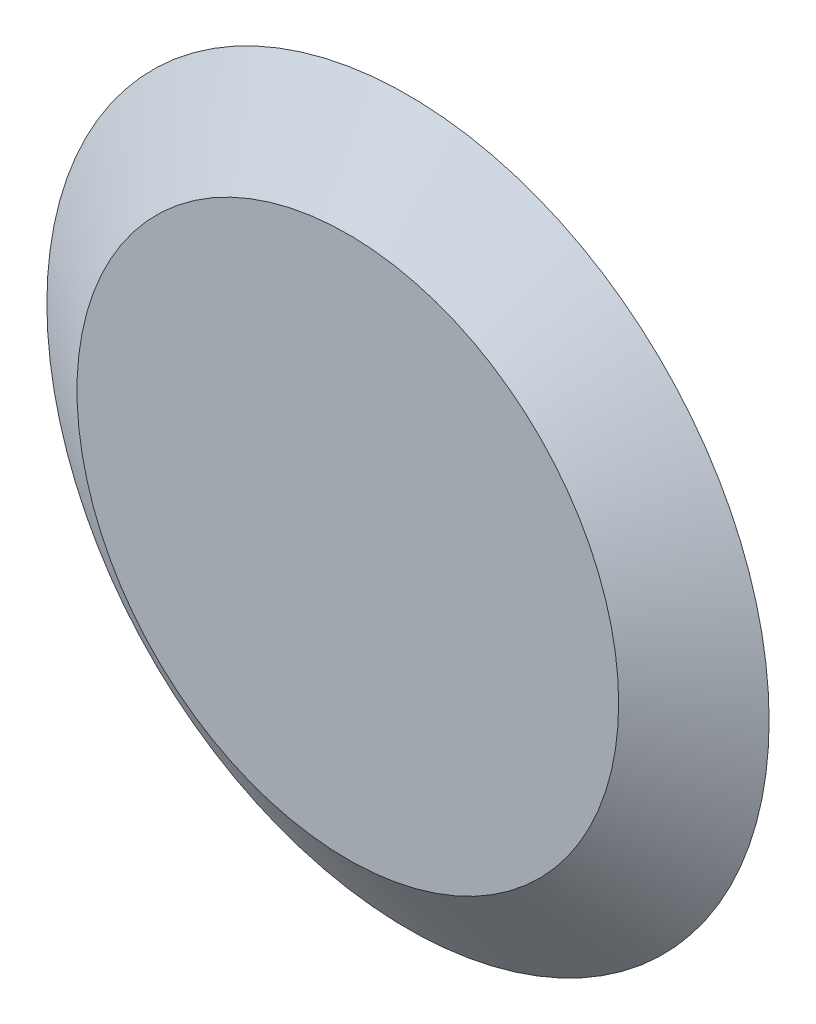
ISO-10303-21;
HEADER;
FILE_DESCRIPTION(('STEP AP214'),'2;1');
FILE_NAME('part.step','',(''),(''),'','','');
FILE_SCHEMA(('AUTOMOTIVE_DESIGN { 1 0 10303 214 1 1 1 1 }'));
ENDSEC;
DATA;
#1=APPLICATION_CONTEXT('core data for automotive mechanical design processes');
#2=APPLICATION_PROTOCOL_DEFINITION('international standard','automotive_design',2000,#1);
#3=PRODUCT_CONTEXT('',#1,'mechanical');
#4=PRODUCT('Part','Part','',(#3));
#5=PRODUCT_RELATED_PRODUCT_CATEGORY('part','',(#4));
#6=PRODUCT_DEFINITION_FORMATION('','',#4);
#7=PRODUCT_DEFINITION_CONTEXT('part definition',#1,'design');
#8=PRODUCT_DEFINITION('design','',#6,#7);
#9=PRODUCT_DEFINITION_SHAPE('','',#8);
#10=(LENGTH_UNIT() NAMED_UNIT(*) SI_UNIT(.MILLI.,.METRE.));
#11=(NAMED_UNIT(*) PLANE_ANGLE_UNIT() SI_UNIT($,.RADIAN.));
#12=(NAMED_UNIT(*) SI_UNIT($,.STERADIAN.) SOLID_ANGLE_UNIT());
#13=UNCERTAINTY_MEASURE_WITH_UNIT(LENGTH_MEASURE(1.E-05),#10,'distance_accuracy_value','');
#14=(GEOMETRIC_REPRESENTATION_CONTEXT(3) GLOBAL_UNCERTAINTY_ASSIGNED_CONTEXT((#13)) GLOBAL_UNIT_ASSIGNED_CONTEXT((#10,
#11,#12)) REPRESENTATION_CONTEXT('',''));
#15=CARTESIAN_POINT('',(0.,0.,0.));
#16=DIRECTION('',(0.,0.,1.));
#17=DIRECTION('',(1.,0.,0.));
#18=AXIS2_PLACEMENT_3D('',#15,#16,#17);
#19=CARTESIAN_POINT('',(0.,0.,0.));
#20=DIRECTION('',(0.,0.,1.));
#21=DIRECTION('',(1.,0.,0.));
#22=AXIS2_PLACEMENT_3D('',#19,#20,#21);
#23=PLANE('',#22);
#24=CARTESIAN_POINT('',(0.,0.,0.));
#25=DIRECTION('',(0.,0.,1.));
#26=DIRECTION('',(1.,0.,0.));
#27=AXIS2_PLACEMENT_3D('',#24,#25,#26);
#28=CIRCLE('',#27,18.);
#29=CARTESIAN_POINT('',(18.,0.,0.));
#30=VERTEX_POINT('',#29);
#31=EDGE_CURVE('E11',#30,#30,#28,.T.);
#32=ORIENTED_EDGE('',*,*,#31,.F.);
#33=EDGE_LOOP('',(#32));
#34=FACE_BOUND('',#33,.T.);
#35=ADVANCED_FACE('F37',(#34),#23,.F.);
#36=CARTESIAN_POINT('',(0.,0.,0.));
#37=DIRECTION('',(0.,0.,1.));
#38=DIRECTION('',(1.,0.,0.));
#39=AXIS2_PLACEMENT_3D('',#36,#37,#38);
#40=CONICAL_SURFACE('',#39,18.,0.982793723247329);
#41=CARTESIAN_POINT('',(0.,0.,4.));
#42=DIRECTION('',(0.,0.,1.));
#43=DIRECTION('',(1.,0.,0.));
#44=AXIS2_PLACEMENT_3D('',#41,#42,#43);
#45=CIRCLE('',#44,24.);
#46=CARTESIAN_POINT('',(24.,0.,4.));
#47=VERTEX_POINT('',#46);
#48=EDGE_CURVE('E45',#47,#47,#45,.T.);
#49=ORIENTED_EDGE('',*,*,#48,.F.);
#50=EDGE_LOOP('',(#49));
#51=FACE_BOUND('',#50,.T.);
#52=ORIENTED_EDGE('',*,*,#31,.T.);
#53=EDGE_LOOP('',(#52));
#54=FACE_BOUND('',#53,.T.);
#55=ADVANCED_FACE('F68',(#51,#54),#40,.T.);
#56=CARTESIAN_POINT('',(0.,0.,8.));
#57=DIRECTION('',(0.,0.,-1.));
#58=DIRECTION('',(1.,0.,0.));
#59=AXIS2_PLACEMENT_3D('',#56,#57,#58);
#60=PLANE('',#59);
#61=CARTESIAN_POINT('',(0.,0.,8.));
#62=DIRECTION('',(0.,0.,1.));
#63=DIRECTION('',(1.,0.,0.));
#64=AXIS2_PLACEMENT_3D('',#61,#62,#63);
#65=CIRCLE('',#64,18.);
#66=CARTESIAN_POINT('',(18.,0.,8.));
#67=VERTEX_POINT('',#66);
#68=EDGE_CURVE('E50',#67,#67,#65,.T.);
#69=ORIENTED_EDGE('',*,*,#68,.T.);
#70=EDGE_LOOP('',(#69));
#71=FACE_BOUND('',#70,.T.);
#72=ADVANCED_FACE('F77',(#71),#60,.F.);
#73=CARTESIAN_POINT('',(0.,0.,8.));
#74=DIRECTION('',(0.,0.,-1.));
#75=DIRECTION('',(1.,0.,0.));
#76=AXIS2_PLACEMENT_3D('',#73,#74,#75);
#77=CONICAL_SURFACE('',#76,18.,0.982793723247329);
#78=ORIENTED_EDGE('',*,*,#48,.T.);
#79=EDGE_LOOP('',(#78));
#80=FACE_BOUND('',#79,.T.);
#81=ORIENTED_EDGE('',*,*,#68,.F.);
#82=EDGE_LOOP('',(#81));
#83=FACE_BOUND('',#82,.T.);
#84=ADVANCED_FACE('F111',(#80,#83),#77,.T.);
#85=CLOSED_SHELL('',(#35,#55,#72,#84));
#86=MANIFOLD_SOLID_BREP('B2',#85);
#87=ADVANCED_BREP_SHAPE_REPRESENTATION('',(#18,#86),#14);
#88=SHAPE_DEFINITION_REPRESENTATION(#9,#87);
ENDSEC;
END-ISO-10303-21;
